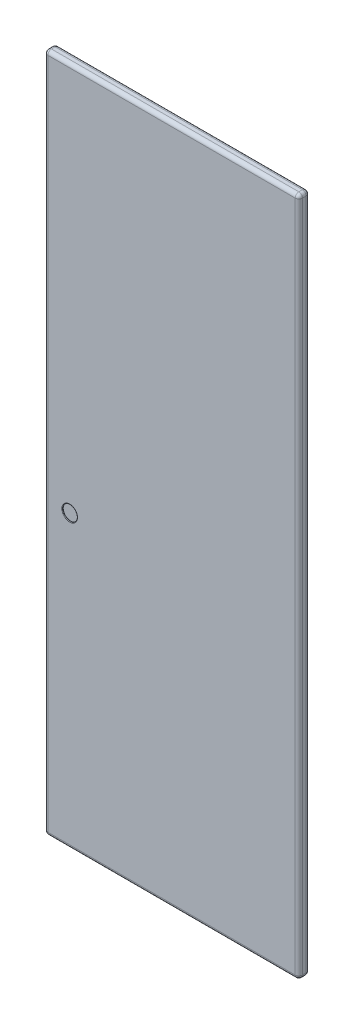
ISO-10303-21;
HEADER;
FILE_DESCRIPTION(('STEP AP214'),'2;1');
FILE_NAME('part.step','',(''),(''),'','','');
FILE_SCHEMA(('AUTOMOTIVE_DESIGN { 1 0 10303 214 1 1 1 1 }'));
ENDSEC;
DATA;
#1=APPLICATION_CONTEXT('core data for automotive mechanical design processes');
#2=APPLICATION_PROTOCOL_DEFINITION('international standard','automotive_design',2000,#1);
#3=PRODUCT_CONTEXT('',#1,'mechanical');
#4=PRODUCT('Part','Part','',(#3));
#5=PRODUCT_RELATED_PRODUCT_CATEGORY('part','',(#4));
#6=PRODUCT_DEFINITION_FORMATION('','',#4);
#7=PRODUCT_DEFINITION_CONTEXT('part definition',#1,'design');
#8=PRODUCT_DEFINITION('design','',#6,#7);
#9=PRODUCT_DEFINITION_SHAPE('','',#8);
#10=(LENGTH_UNIT() NAMED_UNIT(*) SI_UNIT(.MILLI.,.METRE.));
#11=(NAMED_UNIT(*) PLANE_ANGLE_UNIT() SI_UNIT($,.RADIAN.));
#12=(NAMED_UNIT(*) SI_UNIT($,.STERADIAN.) SOLID_ANGLE_UNIT());
#13=UNCERTAINTY_MEASURE_WITH_UNIT(LENGTH_MEASURE(1.E-05),#10,'distance_accuracy_value','');
#14=(GEOMETRIC_REPRESENTATION_CONTEXT(3) GLOBAL_UNCERTAINTY_ASSIGNED_CONTEXT((#13)) GLOBAL_UNIT_ASSIGNED_CONTEXT((#10,
#11,#12)) REPRESENTATION_CONTEXT('',''));
#15=CARTESIAN_POINT('',(0.,0.,0.));
#16=DIRECTION('',(0.,0.,1.));
#17=DIRECTION('',(1.,0.,0.));
#18=AXIS2_PLACEMENT_3D('',#15,#16,#17);
#19=CARTESIAN_POINT('',(0.,0.,30.));
#20=DIRECTION('',(-1.,0.,0.));
#21=DIRECTION('',(0.,0.,1.));
#22=AXIS2_PLACEMENT_3D('',#19,#20,#21);
#23=PLANE('',#22);
#24=DIRECTION('',(0.,1.,0.));
#25=VECTOR('',#24,1.);
#26=CARTESIAN_POINT('',(0.,0.,20.));
#27=LINE('',#26,#25);
#28=CARTESIAN_POINT('',(0.,1860.,20.));
#29=VERTEX_POINT('',#28);
#30=CARTESIAN_POINT('',(0.,10.,20.));
#31=VERTEX_POINT('',#30);
#32=EDGE_CURVE('E141',#29,#31,#27,.F.);
#33=ORIENTED_EDGE('',*,*,#32,.T.);
#34=DIRECTION('',(0.,0.,-1.));
#35=VECTOR('',#34,1.);
#36=CARTESIAN_POINT('',(0.,10.,30.));
#37=LINE('',#36,#35);
#38=CARTESIAN_POINT('',(0.,10.,10.));
#39=VERTEX_POINT('',#38);
#40=EDGE_CURVE('E136',#31,#39,#37,.T.);
#41=ORIENTED_EDGE('',*,*,#40,.T.);
#42=DIRECTION('',(0.,1.,0.));
#43=VECTOR('',#42,1.);
#44=CARTESIAN_POINT('',(0.,0.,10.));
#45=LINE('',#44,#43);
#46=CARTESIAN_POINT('',(0.,1860.,10.));
#47=VERTEX_POINT('',#46);
#48=EDGE_CURVE('E131',#39,#47,#45,.T.);
#49=ORIENTED_EDGE('',*,*,#48,.T.);
#50=DIRECTION('',(0.,0.,-1.));
#51=VECTOR('',#50,1.);
#52=CARTESIAN_POINT('',(0.,1860.,30.));
#53=LINE('',#52,#51);
#54=EDGE_CURVE('E133',#47,#29,#53,.F.);
#55=ORIENTED_EDGE('',*,*,#54,.T.);
#56=EDGE_LOOP('',(#33,#41,#49,#55));
#57=FACE_BOUND('',#56,.T.);
#58=ADVANCED_FACE('F41',(#57),#23,.F.);
#59=CARTESIAN_POINT('',(0.,1870.,30.));
#60=DIRECTION('',(0.,-1.,0.));
#61=DIRECTION('',(1.,0.,0.));
#62=AXIS2_PLACEMENT_3D('',#59,#60,#61);
#63=PLANE('',#62);
#64=DIRECTION('',(0.,0.,-1.));
#65=VECTOR('',#64,1.);
#66=CARTESIAN_POINT('',(-690.,1870.,30.));
#67=LINE('',#66,#65);
#68=CARTESIAN_POINT('',(-690.,1870.,10.));
#69=VERTEX_POINT('',#68);
#70=CARTESIAN_POINT('',(-690.,1870.,20.));
#71=VERTEX_POINT('',#70);
#72=EDGE_CURVE('E62',#69,#71,#67,.F.);
#73=ORIENTED_EDGE('',*,*,#72,.T.);
#74=DIRECTION('',(-1.,0.,0.));
#75=VECTOR('',#74,1.);
#76=CARTESIAN_POINT('',(0.,1870.,20.));
#77=LINE('',#76,#75);
#78=CARTESIAN_POINT('',(-10.,1870.,20.));
#79=VERTEX_POINT('',#78);
#80=EDGE_CURVE('E11',#71,#79,#77,.F.);
#81=ORIENTED_EDGE('',*,*,#80,.T.);
#82=DIRECTION('',(0.,0.,-1.));
#83=VECTOR('',#82,1.);
#84=CARTESIAN_POINT('',(-10.,1870.,30.));
#85=LINE('',#84,#83);
#86=CARTESIAN_POINT('',(-10.,1870.,10.));
#87=VERTEX_POINT('',#86);
#88=EDGE_CURVE('E51',#79,#87,#85,.T.);
#89=ORIENTED_EDGE('',*,*,#88,.T.);
#90=DIRECTION('',(-1.,0.,0.));
#91=VECTOR('',#90,1.);
#92=CARTESIAN_POINT('',(0.,1870.,10.));
#93=LINE('',#92,#91);
#94=EDGE_CURVE('E301',#87,#69,#93,.T.);
#95=ORIENTED_EDGE('',*,*,#94,.T.);
#96=EDGE_LOOP('',(#73,#81,#89,#95));
#97=FACE_BOUND('',#96,.T.);
#98=ADVANCED_FACE('F359',(#97),#63,.F.);
#99=CARTESIAN_POINT('',(-700.,0.,30.));
#100=DIRECTION('',(1.,0.,0.));
#101=DIRECTION('',(0.,0.,-1.));
#102=AXIS2_PLACEMENT_3D('',#99,#100,#101);
#103=PLANE('',#102);
#104=DIRECTION('',(0.,-1.,0.));
#105=VECTOR('',#104,1.);
#106=CARTESIAN_POINT('',(-700.,0.,10.));
#107=LINE('',#106,#105);
#108=CARTESIAN_POINT('',(-700.,1860.,10.));
#109=VERTEX_POINT('',#108);
#110=CARTESIAN_POINT('',(-700.,9.99999999999991,10.));
#111=VERTEX_POINT('',#110);
#112=EDGE_CURVE('E278',#109,#111,#107,.T.);
#113=ORIENTED_EDGE('',*,*,#112,.T.);
#114=DIRECTION('',(0.,0.,-1.));
#115=VECTOR('',#114,1.);
#116=CARTESIAN_POINT('',(-700.,9.99999999999991,30.));
#117=LINE('',#116,#115);
#118=CARTESIAN_POINT('',(-700.,9.99999999999991,20.));
#119=VERTEX_POINT('',#118);
#120=EDGE_CURVE('E284',#111,#119,#117,.F.);
#121=ORIENTED_EDGE('',*,*,#120,.T.);
#122=DIRECTION('',(0.,-1.,0.));
#123=VECTOR('',#122,1.);
#124=CARTESIAN_POINT('',(-700.,1870.,20.));
#125=LINE('',#124,#123);
#126=CARTESIAN_POINT('',(-700.,1860.,20.));
#127=VERTEX_POINT('',#126);
#128=EDGE_CURVE('E281',#119,#127,#125,.F.);
#129=ORIENTED_EDGE('',*,*,#128,.T.);
#130=DIRECTION('',(0.,0.,-1.));
#131=VECTOR('',#130,1.);
#132=CARTESIAN_POINT('',(-700.,1860.,30.));
#133=LINE('',#132,#131);
#134=EDGE_CURVE('E275',#127,#109,#133,.T.);
#135=ORIENTED_EDGE('',*,*,#134,.T.);
#136=EDGE_LOOP('',(#113,#121,#129,#135));
#137=FACE_BOUND('',#136,.T.);
#138=ADVANCED_FACE('F404',(#137),#103,.F.);
#139=CARTESIAN_POINT('',(0.,0.,30.));
#140=DIRECTION('',(0.,1.,0.));
#141=DIRECTION('',(-1.,0.,0.));
#142=AXIS2_PLACEMENT_3D('',#139,#140,#141);
#143=PLANE('',#142);
#144=DIRECTION('',(1.,0.,0.));
#145=VECTOR('',#144,1.);
#146=CARTESIAN_POINT('',(0.,0.,10.));
#147=LINE('',#146,#145);
#148=CARTESIAN_POINT('',(-690.,0.,10.));
#149=VERTEX_POINT('',#148);
#150=CARTESIAN_POINT('',(-10.,0.,10.));
#151=VERTEX_POINT('',#150);
#152=EDGE_CURVE('E256',#149,#151,#147,.T.);
#153=ORIENTED_EDGE('',*,*,#152,.T.);
#154=DIRECTION('',(0.,0.,-1.));
#155=VECTOR('',#154,1.);
#156=CARTESIAN_POINT('',(-10.,0.,30.));
#157=LINE('',#156,#155);
#158=CARTESIAN_POINT('',(-10.,0.,20.));
#159=VERTEX_POINT('',#158);
#160=EDGE_CURVE('E259',#151,#159,#157,.F.);
#161=ORIENTED_EDGE('',*,*,#160,.T.);
#162=DIRECTION('',(1.,0.,0.));
#163=VECTOR('',#162,1.);
#164=CARTESIAN_POINT('',(-700.,0.,20.));
#165=LINE('',#164,#163);
#166=CARTESIAN_POINT('',(-690.,0.,20.));
#167=VERTEX_POINT('',#166);
#168=EDGE_CURVE('E250',#159,#167,#165,.F.);
#169=ORIENTED_EDGE('',*,*,#168,.T.);
#170=DIRECTION('',(0.,0.,-1.));
#171=VECTOR('',#170,1.);
#172=CARTESIAN_POINT('',(-690.,0.,30.));
#173=LINE('',#172,#171);
#174=EDGE_CURVE('E253',#167,#149,#173,.T.);
#175=ORIENTED_EDGE('',*,*,#174,.T.);
#176=EDGE_LOOP('',(#153,#161,#169,#175));
#177=FACE_BOUND('',#176,.T.);
#178=ADVANCED_FACE('F340',(#177),#143,.F.);
#179=CARTESIAN_POINT('',(0.,0.,30.));
#180=DIRECTION('',(0.,0.,1.));
#181=DIRECTION('',(1.,0.,0.));
#182=AXIS2_PLACEMENT_3D('',#179,#180,#181);
#183=PLANE('',#182);
#184=DIRECTION('',(0.,-1.,0.));
#185=VECTOR('',#184,1.);
#186=CARTESIAN_POINT('',(-690.,0.,30.));
#187=LINE('',#186,#185);
#188=CARTESIAN_POINT('',(-690.,1860.,30.));
#189=VERTEX_POINT('',#188);
#190=CARTESIAN_POINT('',(-690.,9.99999999999991,30.));
#191=VERTEX_POINT('',#190);
#192=EDGE_CURVE('E294',#189,#191,#187,.T.);
#193=ORIENTED_EDGE('',*,*,#192,.T.);
#194=DIRECTION('',(1.,0.,0.));
#195=VECTOR('',#194,1.);
#196=CARTESIAN_POINT('',(0.,10.,30.));
#197=LINE('',#196,#195);
#198=CARTESIAN_POINT('',(-10.,10.,30.));
#199=VERTEX_POINT('',#198);
#200=EDGE_CURVE('E297',#191,#199,#197,.T.);
#201=ORIENTED_EDGE('',*,*,#200,.T.);
#202=DIRECTION('',(0.,1.,0.));
#203=VECTOR('',#202,1.);
#204=CARTESIAN_POINT('',(-10.,1870.,30.));
#205=LINE('',#204,#203);
#206=CARTESIAN_POINT('',(-10.,1860.,30.));
#207=VERTEX_POINT('',#206);
#208=EDGE_CURVE('E291',#199,#207,#205,.T.);
#209=ORIENTED_EDGE('',*,*,#208,.T.);
#210=DIRECTION('',(-1.,0.,0.));
#211=VECTOR('',#210,1.);
#212=CARTESIAN_POINT('',(-700.,1860.,30.));
#213=LINE('',#212,#211);
#214=EDGE_CURVE('E288',#207,#189,#213,.T.);
#215=ORIENTED_EDGE('',*,*,#214,.T.);
#216=EDGE_LOOP('',(#193,#201,#209,#215));
#217=FACE_BOUND('',#216,.T.);
#218=CARTESIAN_POINT('',(-630.,800.,30.));
#219=DIRECTION('',(0.,0.,1.));
#220=DIRECTION('',(1.,0.,0.));
#221=AXIS2_PLACEMENT_3D('',#218,#219,#220);
#222=CIRCLE('',#221,21.5);
#223=CARTESIAN_POINT('',(-608.5,800.,30.));
#224=VERTEX_POINT('',#223);
#225=EDGE_CURVE('E714',#224,#224,#222,.F.);
#226=ORIENTED_EDGE('',*,*,#225,.T.);
#227=EDGE_LOOP('',(#226));
#228=FACE_BOUND('',#227,.T.);
#229=ADVANCED_FACE('F370',(#217,#228),#183,.T.);
#230=CARTESIAN_POINT('',(0.,0.,0.));
#231=DIRECTION('',(0.,0.,1.));
#232=DIRECTION('',(1.,0.,0.));
#233=AXIS2_PLACEMENT_3D('',#230,#231,#232);
#234=PLANE('',#233);
#235=DIRECTION('',(0.,1.,0.));
#236=VECTOR('',#235,1.);
#237=CARTESIAN_POINT('',(-10.,0.,0.));
#238=LINE('',#237,#236);
#239=CARTESIAN_POINT('',(-10.,1860.,0.));
#240=VERTEX_POINT('',#239);
#241=CARTESIAN_POINT('',(-10.,10.,0.));
#242=VERTEX_POINT('',#241);
#243=EDGE_CURVE('E165',#240,#242,#238,.F.);
#244=ORIENTED_EDGE('',*,*,#243,.T.);
#245=DIRECTION('',(1.,0.,0.));
#246=VECTOR('',#245,1.);
#247=CARTESIAN_POINT('',(0.,10.,0.));
#248=LINE('',#247,#246);
#249=CARTESIAN_POINT('',(-690.,9.99999999999992,0.));
#250=VERTEX_POINT('',#249);
#251=EDGE_CURVE('E271',#242,#250,#248,.F.);
#252=ORIENTED_EDGE('',*,*,#251,.T.);
#253=DIRECTION('',(0.,-1.,0.));
#254=VECTOR('',#253,1.);
#255=CARTESIAN_POINT('',(-690.,0.,0.));
#256=LINE('',#255,#254);
#257=CARTESIAN_POINT('',(-690.,1860.,0.));
#258=VERTEX_POINT('',#257);
#259=EDGE_CURVE('E268',#250,#258,#256,.F.);
#260=ORIENTED_EDGE('',*,*,#259,.T.);
#261=DIRECTION('',(-1.,0.,0.));
#262=VECTOR('',#261,1.);
#263=CARTESIAN_POINT('',(5.90004235943655E-13,1860.,0.));
#264=LINE('',#263,#262);
#265=EDGE_CURVE('E263',#258,#240,#264,.F.);
#266=ORIENTED_EDGE('',*,*,#265,.T.);
#267=EDGE_LOOP('',(#244,#252,#260,#266));
#268=FACE_BOUND('',#267,.T.);
#269=CARTESIAN_POINT('',(-630.,800.,0.));
#270=DIRECTION('',(0.,0.,1.));
#271=DIRECTION('',(1.,0.,0.));
#272=AXIS2_PLACEMENT_3D('',#269,#270,#271);
#273=CIRCLE('',#272,21.5000000000001);
#274=CARTESIAN_POINT('',(-608.5,800.,0.));
#275=VERTEX_POINT('',#274);
#276=EDGE_CURVE('E153',#275,#275,#273,.T.);
#277=ORIENTED_EDGE('',*,*,#276,.T.);
#278=EDGE_LOOP('',(#277));
#279=FACE_BOUND('',#278,.T.);
#280=ADVANCED_FACE('F353',(#268,#279),#234,.F.);
#281=CARTESIAN_POINT('',(-630.,800.,24.));
#282=DIRECTION('',(0.,0.,1.));
#283=DIRECTION('',(1.,0.,0.));
#284=AXIS2_PLACEMENT_3D('',#281,#282,#283);
#285=CYLINDRICAL_SURFACE('',#284,28.);
#286=CARTESIAN_POINT('',(-630.,800.,24.));
#287=DIRECTION('',(0.,0.,1.));
#288=DIRECTION('',(1.,0.,0.));
#289=AXIS2_PLACEMENT_3D('',#286,#287,#288);
#290=CIRCLE('',#289,28.);
#291=CARTESIAN_POINT('',(-602.,800.,24.));
#292=VERTEX_POINT('',#291);
#293=EDGE_CURVE('E704',#292,#292,#290,.T.);
#294=ORIENTED_EDGE('',*,*,#293,.F.);
#295=EDGE_LOOP('',(#294));
#296=FACE_BOUND('',#295,.T.);
#297=CARTESIAN_POINT('',(-630.,800.,27.));
#298=DIRECTION('',(0.,0.,1.));
#299=DIRECTION('',(1.,0.,0.));
#300=AXIS2_PLACEMENT_3D('',#297,#298,#299);
#301=CIRCLE('',#300,28.);
#302=CARTESIAN_POINT('',(-602.,800.,27.));
#303=VERTEX_POINT('',#302);
#304=EDGE_CURVE('E707',#303,#303,#301,.T.);
#305=ORIENTED_EDGE('',*,*,#304,.T.);
#306=EDGE_LOOP('',(#305));
#307=FACE_BOUND('',#306,.T.);
#308=ADVANCED_FACE('F636',(#296,#307),#285,.F.);
#309=CARTESIAN_POINT('',(-630.,800.,24.));
#310=DIRECTION('',(0.,0.,1.));
#311=DIRECTION('',(1.,0.,0.));
#312=AXIS2_PLACEMENT_3D('',#309,#310,#311);
#313=PLANE('',#312);
#314=ORIENTED_EDGE('',*,*,#293,.T.);
#315=EDGE_LOOP('',(#314));
#316=FACE_BOUND('',#315,.T.);
#317=ADVANCED_FACE('F627',(#316),#313,.T.);
#318=CARTESIAN_POINT('',(-630.,800.,27.));
#319=DIRECTION('',(0.,0.,1.));
#320=DIRECTION('',(1.,0.,0.));
#321=AXIS2_PLACEMENT_3D('',#318,#319,#320);
#322=PLANE('',#321);
#323=CARTESIAN_POINT('',(-630.,800.,27.));
#324=DIRECTION('',(0.,0.,1.));
#325=DIRECTION('',(1.,0.,0.));
#326=AXIS2_PLACEMENT_3D('',#323,#324,#325);
#327=CIRCLE('',#326,21.5);
#328=CARTESIAN_POINT('',(-608.5,800.,27.));
#329=VERTEX_POINT('',#328);
#330=EDGE_CURVE('E722',#329,#329,#327,.T.);
#331=ORIENTED_EDGE('',*,*,#330,.T.);
#332=EDGE_LOOP('',(#331));
#333=FACE_BOUND('',#332,.T.);
#334=ORIENTED_EDGE('',*,*,#304,.F.);
#335=EDGE_LOOP('',(#334));
#336=FACE_BOUND('',#335,.T.);
#337=ADVANCED_FACE('F416',(#333,#336),#322,.F.);
#338=CARTESIAN_POINT('',(-630.,800.,28.5));
#339=DIRECTION('',(0.,0.,1.));
#340=DIRECTION('',(1.,0.,0.));
#341=AXIS2_PLACEMENT_3D('',#338,#339,#340);
#342=TOROIDAL_SURFACE('',#341,21.5,1.5);
#343=ORIENTED_EDGE('',*,*,#330,.F.);
#344=EDGE_LOOP('',(#343));
#345=FACE_BOUND('',#344,.T.);
#346=CARTESIAN_POINT('',(-630.,800.,28.5));
#347=DIRECTION('',(0.,0.,1.));
#348=DIRECTION('',(1.,0.,0.));
#349=AXIS2_PLACEMENT_3D('',#346,#347,#348);
#350=CIRCLE('',#349,20.);
#351=CARTESIAN_POINT('',(-610.,800.,28.5));
#352=VERTEX_POINT('',#351);
#353=EDGE_CURVE('E710',#352,#352,#350,.F.);
#354=ORIENTED_EDGE('',*,*,#353,.F.);
#355=EDGE_LOOP('',(#354));
#356=FACE_BOUND('',#355,.T.);
#357=ADVANCED_FACE('F412',(#345,#356),#342,.T.);
#358=CARTESIAN_POINT('',(-630.,800.,28.5));
#359=DIRECTION('',(0.,0.,1.));
#360=DIRECTION('',(1.,0.,0.));
#361=AXIS2_PLACEMENT_3D('',#358,#359,#360);
#362=TOROIDAL_SURFACE('',#361,21.5,1.5);
#363=ORIENTED_EDGE('',*,*,#225,.F.);
#364=EDGE_LOOP('',(#363));
#365=FACE_BOUND('',#364,.T.);
#366=ORIENTED_EDGE('',*,*,#353,.T.);
#367=EDGE_LOOP('',(#366));
#368=FACE_BOUND('',#367,.T.);
#369=ADVANCED_FACE('F408',(#365,#368),#362,.T.);
#370=CARTESIAN_POINT('',(-630.,800.,6.));
#371=DIRECTION('',(0.,0.,-1.));
#372=DIRECTION('',(-1.,0.,0.));
#373=AXIS2_PLACEMENT_3D('',#370,#371,#372);
#374=CYLINDRICAL_SURFACE('',#373,27.9999999999998);
#375=CARTESIAN_POINT('',(-630.,800.,6.));
#376=DIRECTION('',(0.,0.,-1.));
#377=DIRECTION('',(-1.,0.,0.));
#378=AXIS2_PLACEMENT_3D('',#375,#376,#377);
#379=CIRCLE('',#378,27.9999999999998);
#380=CARTESIAN_POINT('',(-658.,800.,6.));
#381=VERTEX_POINT('',#380);
#382=EDGE_CURVE('E241',#381,#381,#379,.T.);
#383=ORIENTED_EDGE('',*,*,#382,.F.);
#384=EDGE_LOOP('',(#383));
#385=FACE_BOUND('',#384,.T.);
#386=CARTESIAN_POINT('',(-630.,800.,3.));
#387=DIRECTION('',(0.,0.,-1.));
#388=DIRECTION('',(-1.,0.,0.));
#389=AXIS2_PLACEMENT_3D('',#386,#387,#388);
#390=CIRCLE('',#389,27.9999999999998);
#391=CARTESIAN_POINT('',(-658.,800.,3.));
#392=VERTEX_POINT('',#391);
#393=EDGE_CURVE('E235',#392,#392,#390,.T.);
#394=ORIENTED_EDGE('',*,*,#393,.T.);
#395=EDGE_LOOP('',(#394));
#396=FACE_BOUND('',#395,.T.);
#397=ADVANCED_FACE('F411',(#385,#396),#374,.F.);
#398=CARTESIAN_POINT('',(-630.,800.,6.));
#399=DIRECTION('',(0.,0.,-1.));
#400=DIRECTION('',(-1.,0.,0.));
#401=AXIS2_PLACEMENT_3D('',#398,#399,#400);
#402=PLANE('',#401);
#403=ORIENTED_EDGE('',*,*,#382,.T.);
#404=EDGE_LOOP('',(#403));
#405=FACE_BOUND('',#404,.T.);
#406=ADVANCED_FACE('F592',(#405),#402,.T.);
#407=CARTESIAN_POINT('',(-630.,800.,3.));
#408=DIRECTION('',(0.,0.,-1.));
#409=DIRECTION('',(-1.,0.,0.));
#410=AXIS2_PLACEMENT_3D('',#407,#408,#409);
#411=PLANE('',#410);
#412=CARTESIAN_POINT('',(-630.,800.,3.));
#413=DIRECTION('',(0.,0.,-1.));
#414=DIRECTION('',(-1.,0.,0.));
#415=AXIS2_PLACEMENT_3D('',#412,#413,#414);
#416=CIRCLE('',#415,21.5000000000001);
#417=CARTESIAN_POINT('',(-651.5,800.,3.));
#418=VERTEX_POINT('',#417);
#419=EDGE_CURVE('E725',#418,#418,#416,.T.);
#420=ORIENTED_EDGE('',*,*,#419,.T.);
#421=EDGE_LOOP('',(#420));
#422=FACE_BOUND('',#421,.T.);
#423=ORIENTED_EDGE('',*,*,#393,.F.);
#424=EDGE_LOOP('',(#423));
#425=FACE_BOUND('',#424,.T.);
#426=ADVANCED_FACE('F424',(#422,#425),#411,.F.);
#427=CARTESIAN_POINT('',(-630.,800.,1.5));
#428=DIRECTION('',(0.,0.,1.));
#429=DIRECTION('',(1.,0.,0.));
#430=AXIS2_PLACEMENT_3D('',#427,#428,#429);
#431=TOROIDAL_SURFACE('',#430,21.5000000000001,1.5);
#432=ORIENTED_EDGE('',*,*,#276,.F.);
#433=EDGE_LOOP('',(#432));
#434=FACE_BOUND('',#433,.T.);
#435=CARTESIAN_POINT('',(-630.,800.,1.5));
#436=DIRECTION('',(0.,0.,1.));
#437=DIRECTION('',(1.,0.,0.));
#438=AXIS2_PLACEMENT_3D('',#435,#436,#437);
#439=CIRCLE('',#438,20.0000000000001);
#440=CARTESIAN_POINT('',(-610.,800.,1.5));
#441=VERTEX_POINT('',#440);
#442=EDGE_CURVE('E229',#441,#441,#439,.F.);
#443=ORIENTED_EDGE('',*,*,#442,.F.);
#444=EDGE_LOOP('',(#443));
#445=FACE_BOUND('',#444,.T.);
#446=ADVANCED_FACE('F421',(#434,#445),#431,.T.);
#447=CARTESIAN_POINT('',(-630.,800.,1.5));
#448=DIRECTION('',(0.,0.,-1.));
#449=DIRECTION('',(-1.,0.,0.));
#450=AXIS2_PLACEMENT_3D('',#447,#448,#449);
#451=TOROIDAL_SURFACE('',#450,21.5000000000001,1.5);
#452=ORIENTED_EDGE('',*,*,#442,.T.);
#453=EDGE_LOOP('',(#452));
#454=FACE_BOUND('',#453,.T.);
#455=ORIENTED_EDGE('',*,*,#419,.F.);
#456=EDGE_LOOP('',(#455));
#457=FACE_BOUND('',#456,.T.);
#458=ADVANCED_FACE('F418',(#454,#457),#451,.T.);
#459=CARTESIAN_POINT('',(-690.,1860.,30.));
#460=DIRECTION('',(0.,0.,-1.));
#461=DIRECTION('',(-1.,0.,0.));
#462=AXIS2_PLACEMENT_3D('',#459,#460,#461);
#463=CYLINDRICAL_SURFACE('',#462,10.);
#464=CARTESIAN_POINT('',(-690.,1860.,20.));
#465=DIRECTION('',(0.,0.,1.));
#466=DIRECTION('',(1.,0.,0.));
#467=AXIS2_PLACEMENT_3D('',#464,#465,#466);
#468=CIRCLE('',#467,10.);
#469=EDGE_CURVE('E45',#71,#127,#468,.T.);
#470=ORIENTED_EDGE('',*,*,#469,.F.);
#471=ORIENTED_EDGE('',*,*,#72,.F.);
#472=CARTESIAN_POINT('',(-690.,1860.,10.));
#473=DIRECTION('',(0.,0.,-1.));
#474=DIRECTION('',(-1.,0.,0.));
#475=AXIS2_PLACEMENT_3D('',#472,#473,#474);
#476=CIRCLE('',#475,10.);
#477=EDGE_CURVE('E220',#109,#69,#476,.T.);
#478=ORIENTED_EDGE('',*,*,#477,.F.);
#479=ORIENTED_EDGE('',*,*,#134,.F.);
#480=EDGE_LOOP('',(#470,#471,#478,#479));
#481=FACE_BOUND('',#480,.T.);
#482=ADVANCED_FACE('F43',(#481),#463,.T.);
#483=CARTESIAN_POINT('',(-690.,1860.,20.));
#484=DIRECTION('',(0.,0.,1.));
#485=DIRECTION('',(1.,0.,0.));
#486=AXIS2_PLACEMENT_3D('',#483,#484,#485);
#487=SPHERICAL_SURFACE('',#486,10.);
#488=CARTESIAN_POINT('',(-690.,1860.,20.));
#489=DIRECTION('',(-1.,0.,0.));
#490=DIRECTION('',(0.,0.,1.));
#491=AXIS2_PLACEMENT_3D('',#488,#489,#490);
#492=CIRCLE('',#491,10.);
#493=EDGE_CURVE('E213',#71,#189,#492,.F.);
#494=ORIENTED_EDGE('',*,*,#493,.F.);
#495=ORIENTED_EDGE('',*,*,#469,.T.);
#496=CARTESIAN_POINT('',(-690.,1860.,20.));
#497=DIRECTION('',(0.,1.,0.));
#498=DIRECTION('',(0.,0.,1.));
#499=AXIS2_PLACEMENT_3D('',#496,#497,#498);
#500=CIRCLE('',#499,10.);
#501=EDGE_CURVE('E217',#189,#127,#500,.F.);
#502=ORIENTED_EDGE('',*,*,#501,.F.);
#503=EDGE_LOOP('',(#494,#495,#502));
#504=FACE_BOUND('',#503,.T.);
#505=ADVANCED_FACE('F392',(#504),#487,.T.);
#506=CARTESIAN_POINT('',(-690.,1860.,10.));
#507=DIRECTION('',(0.,0.,1.));
#508=DIRECTION('',(1.,0.,0.));
#509=AXIS2_PLACEMENT_3D('',#506,#507,#508);
#510=SPHERICAL_SURFACE('',#509,10.);
#511=CARTESIAN_POINT('',(-690.,1860.,10.));
#512=DIRECTION('',(0.,1.,0.));
#513=DIRECTION('',(0.,0.,1.));
#514=AXIS2_PLACEMENT_3D('',#511,#512,#513);
#515=CIRCLE('',#514,10.);
#516=EDGE_CURVE('E205',#109,#258,#515,.F.);
#517=ORIENTED_EDGE('',*,*,#516,.F.);
#518=ORIENTED_EDGE('',*,*,#477,.T.);
#519=CARTESIAN_POINT('',(-690.,1860.,10.));
#520=DIRECTION('',(-1.,0.,0.));
#521=DIRECTION('',(0.,0.,1.));
#522=AXIS2_PLACEMENT_3D('',#519,#520,#521);
#523=CIRCLE('',#522,10.);
#524=EDGE_CURVE('E209',#258,#69,#523,.F.);
#525=ORIENTED_EDGE('',*,*,#524,.F.);
#526=EDGE_LOOP('',(#517,#518,#525));
#527=FACE_BOUND('',#526,.T.);
#528=ADVANCED_FACE('F390',(#527),#510,.T.);
#529=CARTESIAN_POINT('',(-690.,0.,20.));
#530=DIRECTION('',(0.,1.,0.));
#531=DIRECTION('',(0.,0.,1.));
#532=AXIS2_PLACEMENT_3D('',#529,#530,#531);
#533=CYLINDRICAL_SURFACE('',#532,10.);
#534=ORIENTED_EDGE('',*,*,#501,.T.);
#535=ORIENTED_EDGE('',*,*,#128,.F.);
#536=CARTESIAN_POINT('',(-690.,9.99999999999991,20.));
#537=DIRECTION('',(0.,-1.,0.));
#538=DIRECTION('',(0.,0.,-1.));
#539=AXIS2_PLACEMENT_3D('',#536,#537,#538);
#540=CIRCLE('',#539,10.);
#541=EDGE_CURVE('E198',#191,#119,#540,.T.);
#542=ORIENTED_EDGE('',*,*,#541,.F.);
#543=ORIENTED_EDGE('',*,*,#192,.F.);
#544=EDGE_LOOP('',(#534,#535,#542,#543));
#545=FACE_BOUND('',#544,.T.);
#546=ADVANCED_FACE('F376',(#545),#533,.T.);
#547=CARTESIAN_POINT('',(5.90004235943655E-13,1860.,20.));
#548=DIRECTION('',(1.,0.,0.));
#549=DIRECTION('',(0.,1.,0.));
#550=AXIS2_PLACEMENT_3D('',#547,#548,#549);
#551=CYLINDRICAL_SURFACE('',#550,10.);
#552=ORIENTED_EDGE('',*,*,#493,.T.);
#553=ORIENTED_EDGE('',*,*,#214,.F.);
#554=CARTESIAN_POINT('',(-10.,1860.,20.));
#555=DIRECTION('',(1.,0.,0.));
#556=DIRECTION('',(0.,1.,0.));
#557=AXIS2_PLACEMENT_3D('',#554,#555,#556);
#558=CIRCLE('',#557,10.);
#559=EDGE_CURVE('E194',#79,#207,#558,.T.);
#560=ORIENTED_EDGE('',*,*,#559,.F.);
#561=ORIENTED_EDGE('',*,*,#80,.F.);
#562=EDGE_LOOP('',(#552,#553,#560,#561));
#563=FACE_BOUND('',#562,.T.);
#564=ADVANCED_FACE('F363',(#563),#551,.T.);
#565=CARTESIAN_POINT('',(-10.,1860.,30.));
#566=DIRECTION('',(0.,0.,-1.));
#567=DIRECTION('',(-1.,0.,0.));
#568=AXIS2_PLACEMENT_3D('',#565,#566,#567);
#569=CYLINDRICAL_SURFACE('',#568,10.);
#570=CARTESIAN_POINT('',(-10.,1860.,10.));
#571=DIRECTION('',(0.,0.,-1.));
#572=DIRECTION('',(-1.,0.,0.));
#573=AXIS2_PLACEMENT_3D('',#570,#571,#572);
#574=CIRCLE('',#573,10.);
#575=EDGE_CURVE('E147',#87,#47,#574,.T.);
#576=ORIENTED_EDGE('',*,*,#575,.F.);
#577=ORIENTED_EDGE('',*,*,#88,.F.);
#578=CARTESIAN_POINT('',(-10.,1860.,20.));
#579=DIRECTION('',(0.,0.,1.));
#580=DIRECTION('',(1.,0.,0.));
#581=AXIS2_PLACEMENT_3D('',#578,#579,#580);
#582=CIRCLE('',#581,10.);
#583=EDGE_CURVE('E150',#29,#79,#582,.T.);
#584=ORIENTED_EDGE('',*,*,#583,.F.);
#585=ORIENTED_EDGE('',*,*,#54,.F.);
#586=EDGE_LOOP('',(#576,#577,#584,#585));
#587=FACE_BOUND('',#586,.T.);
#588=ADVANCED_FACE('F146',(#587),#569,.T.);
#589=CARTESIAN_POINT('',(0.,1860.,10.));
#590=DIRECTION('',(-1.,0.,0.));
#591=DIRECTION('',(0.,-1.,0.));
#592=AXIS2_PLACEMENT_3D('',#589,#590,#591);
#593=CYLINDRICAL_SURFACE('',#592,10.);
#594=ORIENTED_EDGE('',*,*,#524,.T.);
#595=ORIENTED_EDGE('',*,*,#94,.F.);
#596=CARTESIAN_POINT('',(-10.,1860.,10.));
#597=DIRECTION('',(1.,0.,0.));
#598=DIRECTION('',(0.,1.,0.));
#599=AXIS2_PLACEMENT_3D('',#596,#597,#598);
#600=CIRCLE('',#599,10.);
#601=EDGE_CURVE('E161',#240,#87,#600,.T.);
#602=ORIENTED_EDGE('',*,*,#601,.F.);
#603=ORIENTED_EDGE('',*,*,#265,.F.);
#604=EDGE_LOOP('',(#594,#595,#602,#603));
#605=FACE_BOUND('',#604,.T.);
#606=ADVANCED_FACE('F358',(#605),#593,.T.);
#607=CARTESIAN_POINT('',(-690.,0.,10.));
#608=DIRECTION('',(0.,-1.,0.));
#609=DIRECTION('',(0.,0.,-1.));
#610=AXIS2_PLACEMENT_3D('',#607,#608,#609);
#611=CYLINDRICAL_SURFACE('',#610,10.);
#612=ORIENTED_EDGE('',*,*,#516,.T.);
#613=ORIENTED_EDGE('',*,*,#259,.F.);
#614=CARTESIAN_POINT('',(-690.,9.99999999999991,10.));
#615=DIRECTION('',(0.,-1.,0.));
#616=DIRECTION('',(0.,0.,-1.));
#617=AXIS2_PLACEMENT_3D('',#614,#615,#616);
#618=CIRCLE('',#617,10.);
#619=EDGE_CURVE('E186',#111,#250,#618,.T.);
#620=ORIENTED_EDGE('',*,*,#619,.F.);
#621=ORIENTED_EDGE('',*,*,#112,.F.);
#622=EDGE_LOOP('',(#612,#613,#620,#621));
#623=FACE_BOUND('',#622,.T.);
#624=ADVANCED_FACE('F389',(#623),#611,.T.);
#625=CARTESIAN_POINT('',(-690.,9.99999999999991,30.));
#626=DIRECTION('',(0.,0.,-1.));
#627=DIRECTION('',(-1.,0.,0.));
#628=AXIS2_PLACEMENT_3D('',#625,#626,#627);
#629=CYLINDRICAL_SURFACE('',#628,10.);
#630=CARTESIAN_POINT('',(-690.,9.99999999999991,20.));
#631=DIRECTION('',(0.,0.,1.));
#632=DIRECTION('',(1.,0.,0.));
#633=AXIS2_PLACEMENT_3D('',#630,#631,#632);
#634=CIRCLE('',#633,10.);
#635=EDGE_CURVE('E201',#119,#167,#634,.T.);
#636=ORIENTED_EDGE('',*,*,#635,.F.);
#637=ORIENTED_EDGE('',*,*,#120,.F.);
#638=CARTESIAN_POINT('',(-690.,9.99999999999991,10.));
#639=DIRECTION('',(0.,0.,-1.));
#640=DIRECTION('',(-1.,0.,0.));
#641=AXIS2_PLACEMENT_3D('',#638,#639,#640);
#642=CIRCLE('',#641,10.);
#643=EDGE_CURVE('E182',#149,#111,#642,.T.);
#644=ORIENTED_EDGE('',*,*,#643,.F.);
#645=ORIENTED_EDGE('',*,*,#174,.F.);
#646=EDGE_LOOP('',(#636,#637,#644,#645));
#647=FACE_BOUND('',#646,.T.);
#648=ADVANCED_FACE('F382',(#647),#629,.T.);
#649=CARTESIAN_POINT('',(-690.,9.99999999999991,20.));
#650=DIRECTION('',(0.,0.,1.));
#651=DIRECTION('',(1.,0.,0.));
#652=AXIS2_PLACEMENT_3D('',#649,#650,#651);
#653=SPHERICAL_SURFACE('',#652,10.);
#654=ORIENTED_EDGE('',*,*,#541,.T.);
#655=ORIENTED_EDGE('',*,*,#635,.T.);
#656=CARTESIAN_POINT('',(-690.,9.99999999999991,20.));
#657=DIRECTION('',(-1.,0.,0.));
#658=DIRECTION('',(0.,0.,1.));
#659=AXIS2_PLACEMENT_3D('',#656,#657,#658);
#660=CIRCLE('',#659,10.);
#661=EDGE_CURVE('E173',#191,#167,#660,.F.);
#662=ORIENTED_EDGE('',*,*,#661,.F.);
#663=EDGE_LOOP('',(#654,#655,#662));
#664=FACE_BOUND('',#663,.T.);
#665=ADVANCED_FACE('F379',(#664),#653,.T.);
#666=CARTESIAN_POINT('',(-10.,1860.,20.));
#667=DIRECTION('',(0.,0.,1.));
#668=DIRECTION('',(1.,0.,0.));
#669=AXIS2_PLACEMENT_3D('',#666,#667,#668);
#670=SPHERICAL_SURFACE('',#669,10.);
#671=ORIENTED_EDGE('',*,*,#583,.T.);
#672=ORIENTED_EDGE('',*,*,#559,.T.);
#673=CARTESIAN_POINT('',(-10.,1860.,20.));
#674=DIRECTION('',(0.,1.,0.));
#675=DIRECTION('',(0.,0.,1.));
#676=AXIS2_PLACEMENT_3D('',#673,#674,#675);
#677=CIRCLE('',#676,10.);
#678=EDGE_CURVE('E167',#29,#207,#677,.F.);
#679=ORIENTED_EDGE('',*,*,#678,.F.);
#680=EDGE_LOOP('',(#671,#672,#679));
#681=FACE_BOUND('',#680,.T.);
#682=ADVANCED_FACE('F365',(#681),#670,.T.);
#683=CARTESIAN_POINT('',(-10.,1860.,10.));
#684=DIRECTION('',(0.,0.,1.));
#685=DIRECTION('',(1.,0.,0.));
#686=AXIS2_PLACEMENT_3D('',#683,#684,#685);
#687=SPHERICAL_SURFACE('',#686,10.);
#688=ORIENTED_EDGE('',*,*,#601,.T.);
#689=ORIENTED_EDGE('',*,*,#575,.T.);
#690=CARTESIAN_POINT('',(-10.,1860.,10.));
#691=DIRECTION('',(0.,1.,0.));
#692=DIRECTION('',(0.,0.,1.));
#693=AXIS2_PLACEMENT_3D('',#690,#691,#692);
#694=CIRCLE('',#693,10.);
#695=EDGE_CURVE('E158',#240,#47,#694,.F.);
#696=ORIENTED_EDGE('',*,*,#695,.F.);
#697=EDGE_LOOP('',(#688,#689,#696));
#698=FACE_BOUND('',#697,.T.);
#699=ADVANCED_FACE('F157',(#698),#687,.T.);
#700=CARTESIAN_POINT('',(-690.,9.99999999999991,10.));
#701=DIRECTION('',(0.,0.,1.));
#702=DIRECTION('',(1.,0.,0.));
#703=AXIS2_PLACEMENT_3D('',#700,#701,#702);
#704=SPHERICAL_SURFACE('',#703,10.);
#705=ORIENTED_EDGE('',*,*,#643,.T.);
#706=ORIENTED_EDGE('',*,*,#619,.T.);
#707=CARTESIAN_POINT('',(-690.,9.99999999999992,10.));
#708=DIRECTION('',(-1.,0.,0.));
#709=DIRECTION('',(0.,0.,1.));
#710=AXIS2_PLACEMENT_3D('',#707,#708,#709);
#711=CIRCLE('',#710,10.);
#712=EDGE_CURVE('E168',#149,#250,#711,.F.);
#713=ORIENTED_EDGE('',*,*,#712,.F.);
#714=EDGE_LOOP('',(#705,#706,#713));
#715=FACE_BOUND('',#714,.T.);
#716=ADVANCED_FACE('F386',(#715),#704,.T.);
#717=CARTESIAN_POINT('',(0.,10.,20.));
#718=DIRECTION('',(-1.,0.,0.));
#719=DIRECTION('',(0.,-1.,0.));
#720=AXIS2_PLACEMENT_3D('',#717,#718,#719);
#721=CYLINDRICAL_SURFACE('',#720,10.);
#722=ORIENTED_EDGE('',*,*,#661,.T.);
#723=ORIENTED_EDGE('',*,*,#168,.F.);
#724=CARTESIAN_POINT('',(-10.,10.,20.));
#725=DIRECTION('',(1.,0.,0.));
#726=DIRECTION('',(0.,1.,0.));
#727=AXIS2_PLACEMENT_3D('',#724,#725,#726);
#728=CIRCLE('',#727,10.);
#729=EDGE_CURVE('E175',#199,#159,#728,.T.);
#730=ORIENTED_EDGE('',*,*,#729,.F.);
#731=ORIENTED_EDGE('',*,*,#200,.F.);
#732=EDGE_LOOP('',(#722,#723,#730,#731));
#733=FACE_BOUND('',#732,.T.);
#734=ADVANCED_FACE('F335',(#733),#721,.T.);
#735=CARTESIAN_POINT('',(-10.,0.,20.));
#736=DIRECTION('',(0.,-1.,0.));
#737=DIRECTION('',(0.,0.,-1.));
#738=AXIS2_PLACEMENT_3D('',#735,#736,#737);
#739=CYLINDRICAL_SURFACE('',#738,10.);
#740=ORIENTED_EDGE('',*,*,#678,.T.);
#741=ORIENTED_EDGE('',*,*,#208,.F.);
#742=CARTESIAN_POINT('',(-10.,10.,20.));
#743=DIRECTION('',(0.,-1.,0.));
#744=DIRECTION('',(0.,0.,-1.));
#745=AXIS2_PLACEMENT_3D('',#742,#743,#744);
#746=CIRCLE('',#745,10.);
#747=EDGE_CURVE('E322',#31,#199,#746,.T.);
#748=ORIENTED_EDGE('',*,*,#747,.F.);
#749=ORIENTED_EDGE('',*,*,#32,.F.);
#750=EDGE_LOOP('',(#740,#741,#748,#749));
#751=FACE_BOUND('',#750,.T.);
#752=ADVANCED_FACE('F368',(#751),#739,.T.);
#753=CARTESIAN_POINT('',(-10.,0.,10.));
#754=DIRECTION('',(0.,1.,0.));
#755=DIRECTION('',(0.,0.,1.));
#756=AXIS2_PLACEMENT_3D('',#753,#754,#755);
#757=CYLINDRICAL_SURFACE('',#756,10.);
#758=ORIENTED_EDGE('',*,*,#695,.T.);
#759=ORIENTED_EDGE('',*,*,#48,.F.);
#760=CARTESIAN_POINT('',(-10.,10.,10.));
#761=DIRECTION('',(0.,-1.,0.));
#762=DIRECTION('',(1.,0.,0.));
#763=AXIS2_PLACEMENT_3D('',#760,#761,#762);
#764=CIRCLE('',#763,10.);
#765=EDGE_CURVE('E318',#242,#39,#764,.T.);
#766=ORIENTED_EDGE('',*,*,#765,.F.);
#767=ORIENTED_EDGE('',*,*,#243,.F.);
#768=EDGE_LOOP('',(#758,#759,#766,#767));
#769=FACE_BOUND('',#768,.T.);
#770=ADVANCED_FACE('F164',(#769),#757,.T.);
#771=CARTESIAN_POINT('',(0.,10.,10.));
#772=DIRECTION('',(1.,0.,0.));
#773=DIRECTION('',(0.,1.,0.));
#774=AXIS2_PLACEMENT_3D('',#771,#772,#773);
#775=CYLINDRICAL_SURFACE('',#774,10.);
#776=ORIENTED_EDGE('',*,*,#712,.T.);
#777=ORIENTED_EDGE('',*,*,#251,.F.);
#778=CARTESIAN_POINT('',(-10.,10.,10.));
#779=DIRECTION('',(1.,0.,0.));
#780=DIRECTION('',(0.,1.,0.));
#781=AXIS2_PLACEMENT_3D('',#778,#779,#780);
#782=CIRCLE('',#781,10.);
#783=EDGE_CURVE('E314',#151,#242,#782,.T.);
#784=ORIENTED_EDGE('',*,*,#783,.F.);
#785=ORIENTED_EDGE('',*,*,#152,.F.);
#786=EDGE_LOOP('',(#776,#777,#784,#785));
#787=FACE_BOUND('',#786,.T.);
#788=ADVANCED_FACE('F350',(#787),#775,.T.);
#789=CARTESIAN_POINT('',(-10.,10.,20.));
#790=DIRECTION('',(0.,0.,1.));
#791=DIRECTION('',(1.,0.,0.));
#792=AXIS2_PLACEMENT_3D('',#789,#790,#791);
#793=SPHERICAL_SURFACE('',#792,10.);
#794=ORIENTED_EDGE('',*,*,#747,.T.);
#795=ORIENTED_EDGE('',*,*,#729,.T.);
#796=CARTESIAN_POINT('',(-10.,10.,20.));
#797=DIRECTION('',(0.,0.,1.));
#798=DIRECTION('',(1.,0.,0.));
#799=AXIS2_PLACEMENT_3D('',#796,#797,#798);
#800=CIRCLE('',#799,10.);
#801=EDGE_CURVE('E311',#31,#159,#800,.F.);
#802=ORIENTED_EDGE('',*,*,#801,.F.);
#803=EDGE_LOOP('',(#794,#795,#802));
#804=FACE_BOUND('',#803,.T.);
#805=ADVANCED_FACE('F330',(#804),#793,.T.);
#806=CARTESIAN_POINT('',(-10.,10.,10.));
#807=DIRECTION('',(0.,0.,1.));
#808=DIRECTION('',(1.,0.,0.));
#809=AXIS2_PLACEMENT_3D('',#806,#807,#808);
#810=SPHERICAL_SURFACE('',#809,10.);
#811=ORIENTED_EDGE('',*,*,#783,.T.);
#812=ORIENTED_EDGE('',*,*,#765,.T.);
#813=CARTESIAN_POINT('',(-10.,10.,10.));
#814=DIRECTION('',(0.,0.,-1.));
#815=DIRECTION('',(-1.,0.,0.));
#816=AXIS2_PLACEMENT_3D('',#813,#814,#815);
#817=CIRCLE('',#816,10.);
#818=EDGE_CURVE('E308',#151,#39,#817,.F.);
#819=ORIENTED_EDGE('',*,*,#818,.F.);
#820=EDGE_LOOP('',(#811,#812,#819));
#821=FACE_BOUND('',#820,.T.);
#822=ADVANCED_FACE('F347',(#821),#810,.T.);
#823=CARTESIAN_POINT('',(-10.,10.,30.));
#824=DIRECTION('',(0.,0.,-1.));
#825=DIRECTION('',(-1.,0.,0.));
#826=AXIS2_PLACEMENT_3D('',#823,#824,#825);
#827=CYLINDRICAL_SURFACE('',#826,10.);
#828=ORIENTED_EDGE('',*,*,#801,.T.);
#829=ORIENTED_EDGE('',*,*,#160,.F.);
#830=ORIENTED_EDGE('',*,*,#818,.T.);
#831=ORIENTED_EDGE('',*,*,#40,.F.);
#832=EDGE_LOOP('',(#828,#829,#830,#831));
#833=FACE_BOUND('',#832,.T.);
#834=ADVANCED_FACE('F345',(#833),#827,.T.);
#835=CLOSED_SHELL('',(#58,#98,#138,#178,#229,#280,#308,#317,#337,#357,#369,#397,#406,#426,#446,
#458,#482,#505,#528,#546,#564,#588,#606,#624,#648,#665,#682,#699,#716,#734,#752,#770,#788,#805,
#822,#834));
#836=MANIFOLD_SOLID_BREP('B2',#835);
#837=ADVANCED_BREP_SHAPE_REPRESENTATION('',(#18,#836),#14);
#838=SHAPE_DEFINITION_REPRESENTATION(#9,#837);
ENDSEC;
END-ISO-10303-21;
